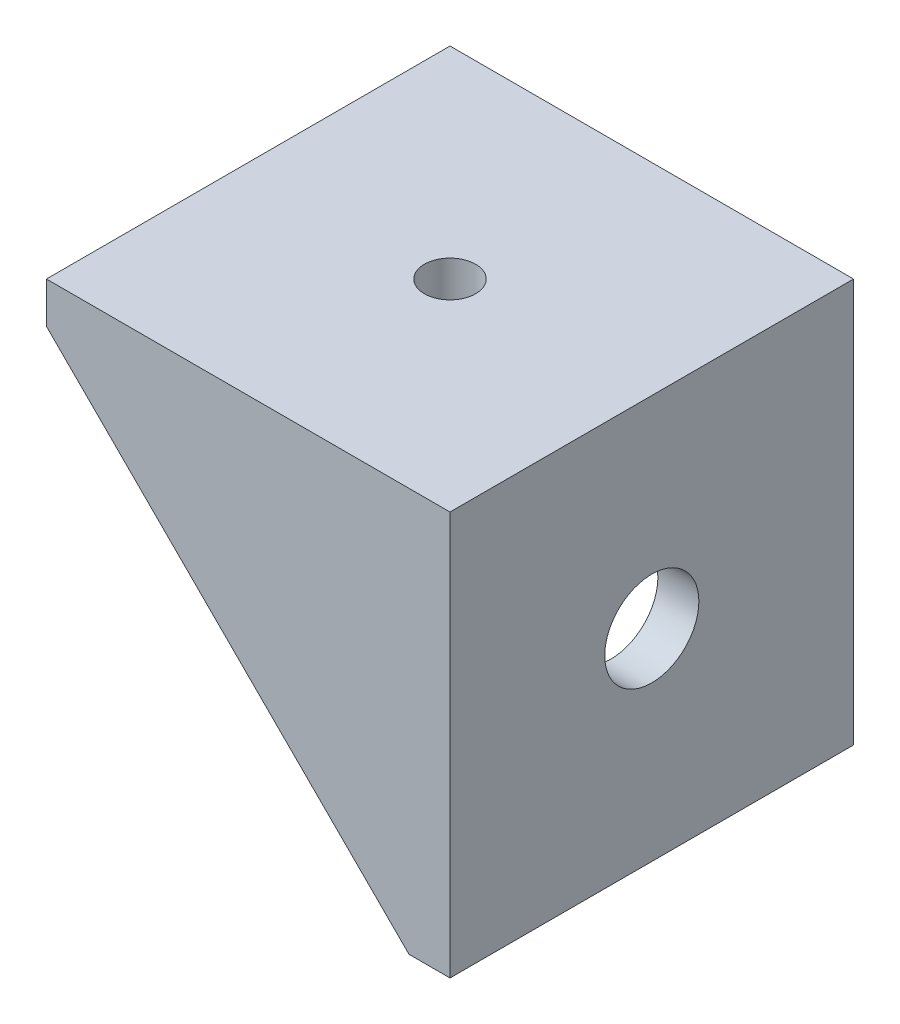
ISO-10303-21;
HEADER;
FILE_DESCRIPTION(('STEP AP214'),'2;1');
FILE_NAME('part.step','',(''),(''),'','','');
FILE_SCHEMA(('AUTOMOTIVE_DESIGN { 1 0 10303 214 1 1 1 1 }'));
ENDSEC;
DATA;
#1=APPLICATION_CONTEXT('core data for automotive mechanical design processes');
#2=APPLICATION_PROTOCOL_DEFINITION('international standard','automotive_design',2000,#1);
#3=PRODUCT_CONTEXT('',#1,'mechanical');
#4=PRODUCT('Part','Part','',(#3));
#5=PRODUCT_RELATED_PRODUCT_CATEGORY('part','',(#4));
#6=PRODUCT_DEFINITION_FORMATION('','',#4);
#7=PRODUCT_DEFINITION_CONTEXT('part definition',#1,'design');
#8=PRODUCT_DEFINITION('design','',#6,#7);
#9=PRODUCT_DEFINITION_SHAPE('','',#8);
#10=(LENGTH_UNIT() NAMED_UNIT(*) SI_UNIT(.MILLI.,.METRE.));
#11=(NAMED_UNIT(*) PLANE_ANGLE_UNIT() SI_UNIT($,.RADIAN.));
#12=(NAMED_UNIT(*) SI_UNIT($,.STERADIAN.) SOLID_ANGLE_UNIT());
#13=UNCERTAINTY_MEASURE_WITH_UNIT(LENGTH_MEASURE(1.E-05),#10,'distance_accuracy_value','');
#14=(GEOMETRIC_REPRESENTATION_CONTEXT(3) GLOBAL_UNCERTAINTY_ASSIGNED_CONTEXT((#13)) GLOBAL_UNIT_ASSIGNED_CONTEXT((#10,
#11,#12)) REPRESENTATION_CONTEXT('',''));
#15=CARTESIAN_POINT('',(0.,0.,0.));
#16=DIRECTION('',(0.,0.,1.));
#17=DIRECTION('',(1.,0.,0.));
#18=AXIS2_PLACEMENT_3D('',#15,#16,#17);
#19=CARTESIAN_POINT('',(0.,-3.048,15.));
#20=DIRECTION('',(0.,1.,0.));
#21=DIRECTION('',(0.,0.,1.));
#22=AXIS2_PLACEMENT_3D('',#19,#20,#21);
#23=PLANE('',#22);
#24=CARTESIAN_POINT('',(-15.,-3.048,0.));
#25=DIRECTION('',(0.,1.,0.));
#26=DIRECTION('',(0.,0.,1.));
#27=AXIS2_PLACEMENT_3D('',#24,#25,#26);
#28=CIRCLE('',#27,1.905);
#29=CARTESIAN_POINT('',(-15.,-3.048,1.905));
#30=VERTEX_POINT('',#29);
#31=EDGE_CURVE('E207',#30,#30,#28,.T.);
#32=ORIENTED_EDGE('',*,*,#31,.T.);
#33=EDGE_LOOP('',(#32));
#34=FACE_BOUND('',#33,.T.);
#35=DIRECTION('',(0.,0.,-1.));
#36=VECTOR('',#35,1.);
#37=CARTESIAN_POINT('',(-30.,-3.048,15.));
#38=LINE('',#37,#36);
#39=CARTESIAN_POINT('',(-30.,-3.048,11.952));
#40=VERTEX_POINT('',#39);
#41=CARTESIAN_POINT('',(-30.,-3.048,-11.952));
#42=VERTEX_POINT('',#41);
#43=EDGE_CURVE('E147',#40,#42,#38,.T.);
#44=ORIENTED_EDGE('',*,*,#43,.T.);
#45=DIRECTION('',(1.,0.,0.));
#46=VECTOR('',#45,1.);
#47=CARTESIAN_POINT('',(0.,-3.048,-11.952));
#48=LINE('',#47,#46);
#49=CARTESIAN_POINT('',(-3.048,-3.048,-11.952));
#50=VERTEX_POINT('',#49);
#51=EDGE_CURVE('E61',#42,#50,#48,.T.);
#52=ORIENTED_EDGE('',*,*,#51,.T.);
#53=DIRECTION('',(0.,0.,-1.));
#54=VECTOR('',#53,1.);
#55=CARTESIAN_POINT('',(-3.048,-3.048,15.));
#56=LINE('',#55,#54);
#57=CARTESIAN_POINT('',(-3.048,-3.048,11.952));
#58=VERTEX_POINT('',#57);
#59=EDGE_CURVE('E145',#58,#50,#56,.T.);
#60=ORIENTED_EDGE('',*,*,#59,.F.);
#61=DIRECTION('',(-1.,0.,0.));
#62=VECTOR('',#61,1.);
#63=CARTESIAN_POINT('',(0.,-3.048,11.952));
#64=LINE('',#63,#62);
#65=EDGE_CURVE('E119',#58,#40,#64,.T.);
#66=ORIENTED_EDGE('',*,*,#65,.T.);
#67=EDGE_LOOP('',(#44,#52,#60,#66));
#68=FACE_BOUND('',#67,.T.);
#69=ADVANCED_FACE('F45',(#34,#68),#23,.F.);
#70=CARTESIAN_POINT('',(-3.048,0.,15.));
#71=DIRECTION('',(1.,0.,0.));
#72=DIRECTION('',(0.,1.,0.));
#73=AXIS2_PLACEMENT_3D('',#70,#71,#72);
#74=PLANE('',#73);
#75=CARTESIAN_POINT('',(-3.048,-15.,0.));
#76=DIRECTION('',(1.,0.,0.));
#77=DIRECTION('',(0.,1.,0.));
#78=AXIS2_PLACEMENT_3D('',#75,#76,#77);
#79=CIRCLE('',#78,3.5);
#80=CARTESIAN_POINT('',(-3.048,-15.,-3.5));
#81=VERTEX_POINT('',#80);
#82=EDGE_CURVE('E223',#81,#81,#79,.T.);
#83=ORIENTED_EDGE('',*,*,#82,.T.);
#84=EDGE_LOOP('',(#83));
#85=FACE_BOUND('',#84,.T.);
#86=ORIENTED_EDGE('',*,*,#59,.T.);
#87=DIRECTION('',(0.,-1.,0.));
#88=VECTOR('',#87,1.);
#89=CARTESIAN_POINT('',(-3.048,0.,-11.952));
#90=LINE('',#89,#88);
#91=CARTESIAN_POINT('',(-3.048,-30.,-11.952));
#92=VERTEX_POINT('',#91);
#93=EDGE_CURVE('E68',#50,#92,#90,.T.);
#94=ORIENTED_EDGE('',*,*,#93,.T.);
#95=DIRECTION('',(0.,0.,-1.));
#96=VECTOR('',#95,1.);
#97=CARTESIAN_POINT('',(-3.048,-30.,15.));
#98=LINE('',#97,#96);
#99=CARTESIAN_POINT('',(-3.048,-30.,11.952));
#100=VERTEX_POINT('',#99);
#101=EDGE_CURVE('E133',#100,#92,#98,.T.);
#102=ORIENTED_EDGE('',*,*,#101,.F.);
#103=DIRECTION('',(0.,1.,0.));
#104=VECTOR('',#103,1.);
#105=CARTESIAN_POINT('',(-3.048,0.,11.952));
#106=LINE('',#105,#104);
#107=EDGE_CURVE('E114',#100,#58,#106,.T.);
#108=ORIENTED_EDGE('',*,*,#107,.T.);
#109=EDGE_LOOP('',(#86,#94,#102,#108));
#110=FACE_BOUND('',#109,.T.);
#111=ADVANCED_FACE('F134',(#85,#110),#74,.F.);
#112=CARTESIAN_POINT('',(0.,-30.,15.));
#113=DIRECTION('',(0.,1.,0.));
#114=DIRECTION('',(0.,0.,1.));
#115=AXIS2_PLACEMENT_3D('',#112,#113,#114);
#116=PLANE('',#115);
#117=DIRECTION('',(1.,0.,0.));
#118=VECTOR('',#117,1.);
#119=CARTESIAN_POINT('',(0.,-30.,-15.));
#120=LINE('',#119,#118);
#121=CARTESIAN_POINT('',(-3.048,-30.,-15.));
#122=VERTEX_POINT('',#121);
#123=CARTESIAN_POINT('',(0.,-30.,-15.));
#124=VERTEX_POINT('',#123);
#125=EDGE_CURVE('E178',#122,#124,#120,.T.);
#126=ORIENTED_EDGE('',*,*,#125,.T.);
#127=DIRECTION('',(0.,0.,-1.));
#128=VECTOR('',#127,1.);
#129=CARTESIAN_POINT('',(0.,-30.,15.));
#130=LINE('',#129,#128);
#131=CARTESIAN_POINT('',(0.,-30.,15.));
#132=VERTEX_POINT('',#131);
#133=EDGE_CURVE('E11',#132,#124,#130,.T.);
#134=ORIENTED_EDGE('',*,*,#133,.F.);
#135=DIRECTION('',(1.,0.,0.));
#136=VECTOR('',#135,1.);
#137=CARTESIAN_POINT('',(0.,-30.,15.));
#138=LINE('',#137,#136);
#139=CARTESIAN_POINT('',(-3.048,-30.,15.));
#140=VERTEX_POINT('',#139);
#141=EDGE_CURVE('E143',#140,#132,#138,.T.);
#142=ORIENTED_EDGE('',*,*,#141,.F.);
#143=EDGE_CURVE('E126',#140,#100,#98,.T.);
#144=ORIENTED_EDGE('',*,*,#143,.T.);
#145=ORIENTED_EDGE('',*,*,#101,.T.);
#146=DIRECTION('',(0.,0.,-1.));
#147=VECTOR('',#146,1.);
#148=CARTESIAN_POINT('',(-3.048,-30.,-11.952));
#149=LINE('',#148,#147);
#150=EDGE_CURVE('E198',#92,#122,#149,.T.);
#151=ORIENTED_EDGE('',*,*,#150,.T.);
#152=EDGE_LOOP('',(#126,#134,#142,#144,#145,#151));
#153=FACE_BOUND('',#152,.T.);
#154=ADVANCED_FACE('F47',(#153),#116,.F.);
#155=CARTESIAN_POINT('',(0.,0.,15.));
#156=DIRECTION('',(-1.,0.,0.));
#157=DIRECTION('',(0.,0.,1.));
#158=AXIS2_PLACEMENT_3D('',#155,#156,#157);
#159=PLANE('',#158);
#160=CARTESIAN_POINT('',(0.,-15.,0.));
#161=DIRECTION('',(1.,0.,0.));
#162=DIRECTION('',(0.,0.,-1.));
#163=AXIS2_PLACEMENT_3D('',#160,#161,#162);
#164=CIRCLE('',#163,3.5);
#165=CARTESIAN_POINT('',(0.,-15.,-3.5));
#166=VERTEX_POINT('',#165);
#167=EDGE_CURVE('E227',#166,#166,#164,.T.);
#168=ORIENTED_EDGE('',*,*,#167,.F.);
#169=EDGE_LOOP('',(#168));
#170=FACE_BOUND('',#169,.T.);
#171=DIRECTION('',(0.,1.,0.));
#172=VECTOR('',#171,1.);
#173=CARTESIAN_POINT('',(0.,0.,-15.));
#174=LINE('',#173,#172);
#175=CARTESIAN_POINT('',(0.,0.,-15.));
#176=VERTEX_POINT('',#175);
#177=EDGE_CURVE('E173',#124,#176,#174,.T.);
#178=ORIENTED_EDGE('',*,*,#177,.T.);
#179=DIRECTION('',(0.,0.,-1.));
#180=VECTOR('',#179,1.);
#181=CARTESIAN_POINT('',(0.,0.,15.));
#182=LINE('',#181,#180);
#183=CARTESIAN_POINT('',(0.,0.,15.));
#184=VERTEX_POINT('',#183);
#185=EDGE_CURVE('E54',#184,#176,#182,.T.);
#186=ORIENTED_EDGE('',*,*,#185,.F.);
#187=DIRECTION('',(0.,1.,0.));
#188=VECTOR('',#187,1.);
#189=CARTESIAN_POINT('',(0.,0.,15.));
#190=LINE('',#189,#188);
#191=EDGE_CURVE('E188',#132,#184,#190,.T.);
#192=ORIENTED_EDGE('',*,*,#191,.F.);
#193=ORIENTED_EDGE('',*,*,#133,.T.);
#194=EDGE_LOOP('',(#178,#186,#192,#193));
#195=FACE_BOUND('',#194,.T.);
#196=ADVANCED_FACE('F235',(#170,#195),#159,.F.);
#197=CARTESIAN_POINT('',(0.,0.,15.));
#198=DIRECTION('',(0.,-1.,0.));
#199=DIRECTION('',(0.,0.,-1.));
#200=AXIS2_PLACEMENT_3D('',#197,#198,#199);
#201=PLANE('',#200);
#202=CARTESIAN_POINT('',(-15.,0.,0.));
#203=DIRECTION('',(0.,1.,0.));
#204=DIRECTION('',(0.,0.,1.));
#205=AXIS2_PLACEMENT_3D('',#202,#203,#204);
#206=CIRCLE('',#205,1.905);
#207=CARTESIAN_POINT('',(-15.,0.,1.905));
#208=VERTEX_POINT('',#207);
#209=EDGE_CURVE('E219',#208,#208,#206,.T.);
#210=ORIENTED_EDGE('',*,*,#209,.F.);
#211=EDGE_LOOP('',(#210));
#212=FACE_BOUND('',#211,.T.);
#213=DIRECTION('',(-1.,0.,0.));
#214=VECTOR('',#213,1.);
#215=CARTESIAN_POINT('',(0.,0.,-15.));
#216=LINE('',#215,#214);
#217=CARTESIAN_POINT('',(-30.,0.,-15.));
#218=VERTEX_POINT('',#217);
#219=EDGE_CURVE('E166',#176,#218,#216,.T.);
#220=ORIENTED_EDGE('',*,*,#219,.T.);
#221=DIRECTION('',(0.,0.,-1.));
#222=VECTOR('',#221,1.);
#223=CARTESIAN_POINT('',(-30.,0.,15.));
#224=LINE('',#223,#222);
#225=CARTESIAN_POINT('',(-30.,0.,15.));
#226=VERTEX_POINT('',#225);
#227=EDGE_CURVE('E155',#226,#218,#224,.T.);
#228=ORIENTED_EDGE('',*,*,#227,.F.);
#229=DIRECTION('',(-1.,0.,0.));
#230=VECTOR('',#229,1.);
#231=CARTESIAN_POINT('',(0.,0.,15.));
#232=LINE('',#231,#230);
#233=EDGE_CURVE('E167',#184,#226,#232,.T.);
#234=ORIENTED_EDGE('',*,*,#233,.F.);
#235=ORIENTED_EDGE('',*,*,#185,.T.);
#236=EDGE_LOOP('',(#220,#228,#234,#235));
#237=FACE_BOUND('',#236,.T.);
#238=ADVANCED_FACE('F164',(#212,#237),#201,.F.);
#239=CARTESIAN_POINT('',(-30.,0.,15.));
#240=DIRECTION('',(1.,0.,0.));
#241=DIRECTION('',(0.,0.,-1.));
#242=AXIS2_PLACEMENT_3D('',#239,#240,#241);
#243=PLANE('',#242);
#244=DIRECTION('',(0.,-1.,0.));
#245=VECTOR('',#244,1.);
#246=CARTESIAN_POINT('',(-30.,0.,-15.));
#247=LINE('',#246,#245);
#248=CARTESIAN_POINT('',(-30.,-3.048,-15.));
#249=VERTEX_POINT('',#248);
#250=EDGE_CURVE('E150',#218,#249,#247,.T.);
#251=ORIENTED_EDGE('',*,*,#250,.T.);
#252=DIRECTION('',(0.,0.,-1.));
#253=VECTOR('',#252,1.);
#254=CARTESIAN_POINT('',(-30.,-3.048,-11.952));
#255=LINE('',#254,#253);
#256=EDGE_CURVE('E195',#42,#249,#255,.T.);
#257=ORIENTED_EDGE('',*,*,#256,.F.);
#258=ORIENTED_EDGE('',*,*,#43,.F.);
#259=CARTESIAN_POINT('',(-30.,-3.048,15.));
#260=VERTEX_POINT('',#259);
#261=EDGE_CURVE('E129',#260,#40,#38,.T.);
#262=ORIENTED_EDGE('',*,*,#261,.F.);
#263=DIRECTION('',(0.,-1.,0.));
#264=VECTOR('',#263,1.);
#265=CARTESIAN_POINT('',(-30.,0.,15.));
#266=LINE('',#265,#264);
#267=EDGE_CURVE('E138',#226,#260,#266,.T.);
#268=ORIENTED_EDGE('',*,*,#267,.F.);
#269=ORIENTED_EDGE('',*,*,#227,.T.);
#270=EDGE_LOOP('',(#251,#257,#258,#262,#268,#269));
#271=FACE_BOUND('',#270,.T.);
#272=ADVANCED_FACE('F243',(#271),#243,.F.);
#273=CARTESIAN_POINT('',(0.,0.,15.));
#274=DIRECTION('',(0.,0.,1.));
#275=DIRECTION('',(1.,0.,0.));
#276=AXIS2_PLACEMENT_3D('',#273,#274,#275);
#277=PLANE('',#276);
#278=ORIENTED_EDGE('',*,*,#141,.T.);
#279=ORIENTED_EDGE('',*,*,#191,.T.);
#280=ORIENTED_EDGE('',*,*,#233,.T.);
#281=ORIENTED_EDGE('',*,*,#267,.T.);
#282=DIRECTION('',(0.707106781186548,-0.707106781186548,0.));
#283=VECTOR('',#282,1.);
#284=CARTESIAN_POINT('',(-16.524,-16.524,15.));
#285=LINE('',#284,#283);
#286=EDGE_CURVE('E131',#260,#140,#285,.T.);
#287=ORIENTED_EDGE('',*,*,#286,.T.);
#288=EDGE_LOOP('',(#278,#279,#280,#281,#287));
#289=FACE_BOUND('',#288,.T.);
#290=ADVANCED_FACE('F269',(#289),#277,.T.);
#291=CARTESIAN_POINT('',(0.,0.,-15.));
#292=DIRECTION('',(0.,0.,1.));
#293=DIRECTION('',(1.,0.,0.));
#294=AXIS2_PLACEMENT_3D('',#291,#292,#293);
#295=PLANE('',#294);
#296=ORIENTED_EDGE('',*,*,#125,.F.);
#297=DIRECTION('',(-0.707106781186548,0.707106781186548,0.));
#298=VECTOR('',#297,1.);
#299=CARTESIAN_POINT('',(-16.524,-16.524,-15.));
#300=LINE('',#299,#298);
#301=EDGE_CURVE('E204',#122,#249,#300,.T.);
#302=ORIENTED_EDGE('',*,*,#301,.T.);
#303=ORIENTED_EDGE('',*,*,#250,.F.);
#304=ORIENTED_EDGE('',*,*,#219,.F.);
#305=ORIENTED_EDGE('',*,*,#177,.F.);
#306=EDGE_LOOP('',(#296,#302,#303,#304,#305));
#307=FACE_BOUND('',#306,.T.);
#308=ADVANCED_FACE('F172',(#307),#295,.F.);
#309=CARTESIAN_POINT('',(-16.524,-16.524,11.952));
#310=DIRECTION('',(-0.707106781186547,-0.707106781186547,0.));
#311=DIRECTION('',(0.707106781186548,-0.707106781186548,0.));
#312=AXIS2_PLACEMENT_3D('',#309,#310,#311);
#313=PLANE('',#312);
#314=ORIENTED_EDGE('',*,*,#286,.F.);
#315=ORIENTED_EDGE('',*,*,#261,.T.);
#316=DIRECTION('',(0.707106781186548,-0.707106781186548,0.));
#317=VECTOR('',#316,1.);
#318=CARTESIAN_POINT('',(-16.524,-16.524,11.952));
#319=LINE('',#318,#317);
#320=EDGE_CURVE('E117',#40,#100,#319,.T.);
#321=ORIENTED_EDGE('',*,*,#320,.T.);
#322=ORIENTED_EDGE('',*,*,#143,.F.);
#323=EDGE_LOOP('',(#314,#315,#321,#322));
#324=FACE_BOUND('',#323,.T.);
#325=ADVANCED_FACE('F124',(#324),#313,.T.);
#326=CARTESIAN_POINT('',(0.,0.,11.952));
#327=DIRECTION('',(0.,0.,1.));
#328=DIRECTION('',(1.,0.,0.));
#329=AXIS2_PLACEMENT_3D('',#326,#327,#328);
#330=PLANE('',#329);
#331=ORIENTED_EDGE('',*,*,#320,.F.);
#332=ORIENTED_EDGE('',*,*,#65,.F.);
#333=ORIENTED_EDGE('',*,*,#107,.F.);
#334=EDGE_LOOP('',(#331,#332,#333));
#335=FACE_BOUND('',#334,.T.);
#336=ADVANCED_FACE('F116',(#335),#330,.F.);
#337=CARTESIAN_POINT('',(-16.524,-16.524,-11.952));
#338=DIRECTION('',(-0.707106781186547,-0.707106781186547,0.));
#339=DIRECTION('',(0.707106781186548,-0.707106781186548,0.));
#340=AXIS2_PLACEMENT_3D('',#337,#338,#339);
#341=PLANE('',#340);
#342=ORIENTED_EDGE('',*,*,#301,.F.);
#343=ORIENTED_EDGE('',*,*,#150,.F.);
#344=DIRECTION('',(-0.707106781186548,0.707106781186548,0.));
#345=VECTOR('',#344,1.);
#346=CARTESIAN_POINT('',(-16.524,-16.524,-11.952));
#347=LINE('',#346,#345);
#348=EDGE_CURVE('E210',#92,#42,#347,.T.);
#349=ORIENTED_EDGE('',*,*,#348,.T.);
#350=ORIENTED_EDGE('',*,*,#256,.T.);
#351=EDGE_LOOP('',(#342,#343,#349,#350));
#352=FACE_BOUND('',#351,.T.);
#353=ADVANCED_FACE('F239',(#352),#341,.T.);
#354=CARTESIAN_POINT('',(0.,0.,-11.952));
#355=DIRECTION('',(0.,0.,1.));
#356=DIRECTION('',(1.,0.,0.));
#357=AXIS2_PLACEMENT_3D('',#354,#355,#356);
#358=PLANE('',#357);
#359=ORIENTED_EDGE('',*,*,#93,.F.);
#360=ORIENTED_EDGE('',*,*,#51,.F.);
#361=ORIENTED_EDGE('',*,*,#348,.F.);
#362=EDGE_LOOP('',(#359,#360,#361));
#363=FACE_BOUND('',#362,.T.);
#364=ADVANCED_FACE('F246',(#363),#358,.T.);
#365=CARTESIAN_POINT('',(-15.,-30.,0.));
#366=DIRECTION('',(0.,1.,0.));
#367=DIRECTION('',(0.,0.,1.));
#368=AXIS2_PLACEMENT_3D('',#365,#366,#367);
#369=CYLINDRICAL_SURFACE('',#368,1.905);
#370=CARTESIAN_POINT('',(-15.,0.,1.905));
#371=CARTESIAN_POINT('',(-15.,-0.0317500000000005,1.905));
#372=CARTESIAN_POINT('',(-15.,-0.0635000000000011,1.905));
#373=CARTESIAN_POINT('',(-15.,-0.127000000000001,1.905));
#374=CARTESIAN_POINT('',(-15.,-0.15875,1.905));
#375=CARTESIAN_POINT('',(-15.,-0.22225,1.905));
#376=CARTESIAN_POINT('',(-15.,-0.254000000000001,1.905));
#377=CARTESIAN_POINT('',(-15.,-0.317500000000001,1.905));
#378=CARTESIAN_POINT('',(-15.,-0.34925,1.905));
#379=CARTESIAN_POINT('',(-15.,-0.41275,1.905));
#380=CARTESIAN_POINT('',(-15.,-0.4445,1.905));
#381=CARTESIAN_POINT('',(-15.,-0.508,1.905));
#382=CARTESIAN_POINT('',(-15.,-0.53975,1.905));
#383=CARTESIAN_POINT('',(-15.,-0.60325,1.905));
#384=CARTESIAN_POINT('',(-15.,-0.635,1.905));
#385=CARTESIAN_POINT('',(-15.,-0.6985,1.905));
#386=CARTESIAN_POINT('',(-15.,-0.730249999999999,1.905));
#387=CARTESIAN_POINT('',(-15.,-0.793749999999999,1.905));
#388=CARTESIAN_POINT('',(-15.,-0.8255,1.905));
#389=CARTESIAN_POINT('',(-15.,-0.889000000000001,1.905));
#390=CARTESIAN_POINT('',(-15.,-0.920750000000001,1.905));
#391=CARTESIAN_POINT('',(-15.,-0.984250000000001,1.905));
#392=CARTESIAN_POINT('',(-15.,-1.016,1.905));
#393=CARTESIAN_POINT('',(-15.,-1.0795,1.905));
#394=CARTESIAN_POINT('',(-15.,-1.11125,1.905));
#395=CARTESIAN_POINT('',(-15.,-1.17475,1.905));
#396=CARTESIAN_POINT('',(-15.,-1.2065,1.905));
#397=CARTESIAN_POINT('',(-15.,-1.27,1.905));
#398=CARTESIAN_POINT('',(-15.,-1.30175,1.905));
#399=CARTESIAN_POINT('',(-15.,-1.36525,1.905));
#400=CARTESIAN_POINT('',(-15.,-1.397,1.905));
#401=CARTESIAN_POINT('',(-15.,-1.4605,1.905));
#402=CARTESIAN_POINT('',(-15.,-1.49225,1.905));
#403=CARTESIAN_POINT('',(-15.,-1.55575,1.905));
#404=CARTESIAN_POINT('',(-15.,-1.5875,1.905));
#405=CARTESIAN_POINT('',(-15.,-1.651,1.905));
#406=CARTESIAN_POINT('',(-15.,-1.68275,1.905));
#407=CARTESIAN_POINT('',(-15.,-1.74625,1.905));
#408=CARTESIAN_POINT('',(-15.,-1.778,1.905));
#409=CARTESIAN_POINT('',(-15.,-1.8415,1.905));
#410=CARTESIAN_POINT('',(-15.,-1.87325,1.905));
#411=CARTESIAN_POINT('',(-15.,-1.93675,1.905));
#412=CARTESIAN_POINT('',(-15.,-1.9685,1.905));
#413=CARTESIAN_POINT('',(-15.,-2.032,1.905));
#414=CARTESIAN_POINT('',(-15.,-2.06375,1.905));
#415=CARTESIAN_POINT('',(-15.,-2.12725,1.905));
#416=CARTESIAN_POINT('',(-15.,-2.159,1.905));
#417=CARTESIAN_POINT('',(-15.,-2.2225,1.905));
#418=CARTESIAN_POINT('',(-15.,-2.25425,1.905));
#419=CARTESIAN_POINT('',(-15.,-2.31775,1.905));
#420=CARTESIAN_POINT('',(-15.,-2.3495,1.905));
#421=CARTESIAN_POINT('',(-15.,-2.413,1.905));
#422=CARTESIAN_POINT('',(-15.,-2.44475,1.905));
#423=CARTESIAN_POINT('',(-15.,-2.50825,1.905));
#424=CARTESIAN_POINT('',(-15.,-2.54,1.905));
#425=CARTESIAN_POINT('',(-15.,-2.6035,1.905));
#426=CARTESIAN_POINT('',(-15.,-2.63525,1.905));
#427=CARTESIAN_POINT('',(-15.,-2.69875,1.905));
#428=CARTESIAN_POINT('',(-15.,-2.7305,1.905));
#429=CARTESIAN_POINT('',(-15.,-2.794,1.905));
#430=CARTESIAN_POINT('',(-15.,-2.82575,1.905));
#431=CARTESIAN_POINT('',(-15.,-2.88925,1.905));
#432=CARTESIAN_POINT('',(-15.,-2.921,1.905));
#433=CARTESIAN_POINT('',(-15.,-2.9845,1.905));
#434=CARTESIAN_POINT('',(-15.,-3.01625,1.905));
#435=CARTESIAN_POINT('',(-15.,-3.048,1.905));
#436=B_SPLINE_CURVE_WITH_KNOTS('',3,(#370,#371,#372,#373,#374,#375,#376,#377,#378,#379,#380,
#381,#382,#383,#384,#385,#386,#387,#388,#389,#390,#391,#392,#393,#394,#395,#396,#397,#398,#399,
#400,#401,#402,#403,#404,#405,#406,#407,#408,#409,#410,#411,#412,#413,#414,#415,#416,#417,#418,
#419,#420,#421,#422,#423,#424,#425,#426,#427,#428,#429,#430,#431,#432,#433,#434,#435),
.UNSPECIFIED.,.F.,.F.,(4,2,2,2,2,2,2,2,2,2,2,2,2,2,2,2,2,2,2,2,2,2,2,2,2,2,2,2,2,2,2,2,4),(0.,
0.0952500000000016,0.1905,0.285750000000001,0.380999999999999,0.476250000000001,
0.571499999999999,0.666750000000001,0.761999999999999,0.85725,0.952500000000002,1.04775,1.143,
1.23825,1.3335,1.42875,1.524,1.61925,1.7145,1.80975,1.905,2.00025,2.0955,2.19075,2.286,2.38125,
2.4765,2.57175,2.667,2.76225,2.8575,2.95275,3.048),.UNSPECIFIED.);
#437=EDGE_CURVE('BSEAM248',#208,#30,#436,.T.);
#438=ORIENTED_EDGE('',*,*,#209,.T.);
#439=ORIENTED_EDGE('',*,*,#31,.F.);
#440=ORIENTED_EDGE('',*,*,#437,.T.);
#441=ORIENTED_EDGE('',*,*,#437,.F.);
#442=EDGE_LOOP('',(#438,#440,#439,#441));
#443=FACE_BOUND('',#442,.T.);
#444=ADVANCED_FACE('F248',(#443),#369,.F.);
#445=CARTESIAN_POINT('',(-30.,-15.,0.));
#446=DIRECTION('',(1.,0.,0.));
#447=DIRECTION('',(0.,0.,-1.));
#448=AXIS2_PLACEMENT_3D('',#445,#446,#447);
#449=CYLINDRICAL_SURFACE('',#448,3.5);
#450=CARTESIAN_POINT('',(0.,-15.,-3.5));
#451=CARTESIAN_POINT('',(-0.0317500000000005,-15.,-3.5));
#452=CARTESIAN_POINT('',(-0.0635000000000011,-15.,-3.5));
#453=CARTESIAN_POINT('',(-0.127000000000001,-15.,-3.5));
#454=CARTESIAN_POINT('',(-0.15875,-15.,-3.5));
#455=CARTESIAN_POINT('',(-0.22225,-15.,-3.5));
#456=CARTESIAN_POINT('',(-0.254000000000001,-15.,-3.5));
#457=CARTESIAN_POINT('',(-0.317500000000001,-15.,-3.5));
#458=CARTESIAN_POINT('',(-0.34925,-15.,-3.5));
#459=CARTESIAN_POINT('',(-0.41275,-15.,-3.5));
#460=CARTESIAN_POINT('',(-0.4445,-15.,-3.5));
#461=CARTESIAN_POINT('',(-0.508,-15.,-3.5));
#462=CARTESIAN_POINT('',(-0.53975,-15.,-3.5));
#463=CARTESIAN_POINT('',(-0.60325,-15.,-3.5));
#464=CARTESIAN_POINT('',(-0.635,-15.,-3.5));
#465=CARTESIAN_POINT('',(-0.6985,-15.,-3.5));
#466=CARTESIAN_POINT('',(-0.730249999999999,-15.,-3.5));
#467=CARTESIAN_POINT('',(-0.793749999999999,-15.,-3.5));
#468=CARTESIAN_POINT('',(-0.8255,-15.,-3.5));
#469=CARTESIAN_POINT('',(-0.889000000000001,-15.,-3.5));
#470=CARTESIAN_POINT('',(-0.920750000000001,-15.,-3.5));
#471=CARTESIAN_POINT('',(-0.984250000000001,-15.,-3.5));
#472=CARTESIAN_POINT('',(-1.016,-15.,-3.5));
#473=CARTESIAN_POINT('',(-1.0795,-15.,-3.5));
#474=CARTESIAN_POINT('',(-1.11125,-15.,-3.5));
#475=CARTESIAN_POINT('',(-1.17475,-15.,-3.5));
#476=CARTESIAN_POINT('',(-1.2065,-15.,-3.5));
#477=CARTESIAN_POINT('',(-1.27,-15.,-3.5));
#478=CARTESIAN_POINT('',(-1.30175,-15.,-3.5));
#479=CARTESIAN_POINT('',(-1.36525,-15.,-3.5));
#480=CARTESIAN_POINT('',(-1.397,-15.,-3.5));
#481=CARTESIAN_POINT('',(-1.4605,-15.,-3.5));
#482=CARTESIAN_POINT('',(-1.49225,-15.,-3.5));
#483=CARTESIAN_POINT('',(-1.55575,-15.,-3.5));
#484=CARTESIAN_POINT('',(-1.5875,-15.,-3.5));
#485=CARTESIAN_POINT('',(-1.651,-15.,-3.5));
#486=CARTESIAN_POINT('',(-1.68275,-15.,-3.5));
#487=CARTESIAN_POINT('',(-1.74625,-15.,-3.5));
#488=CARTESIAN_POINT('',(-1.778,-15.,-3.5));
#489=CARTESIAN_POINT('',(-1.8415,-15.,-3.5));
#490=CARTESIAN_POINT('',(-1.87325,-15.,-3.5));
#491=CARTESIAN_POINT('',(-1.93675,-15.,-3.5));
#492=CARTESIAN_POINT('',(-1.9685,-15.,-3.5));
#493=CARTESIAN_POINT('',(-2.032,-15.,-3.5));
#494=CARTESIAN_POINT('',(-2.06375,-15.,-3.5));
#495=CARTESIAN_POINT('',(-2.12725,-15.,-3.5));
#496=CARTESIAN_POINT('',(-2.159,-15.,-3.5));
#497=CARTESIAN_POINT('',(-2.2225,-15.,-3.5));
#498=CARTESIAN_POINT('',(-2.25425,-15.,-3.5));
#499=CARTESIAN_POINT('',(-2.31775,-15.,-3.5));
#500=CARTESIAN_POINT('',(-2.3495,-15.,-3.5));
#501=CARTESIAN_POINT('',(-2.413,-15.,-3.5));
#502=CARTESIAN_POINT('',(-2.44475,-15.,-3.5));
#503=CARTESIAN_POINT('',(-2.50825,-15.,-3.5));
#504=CARTESIAN_POINT('',(-2.54,-15.,-3.5));
#505=CARTESIAN_POINT('',(-2.6035,-15.,-3.5));
#506=CARTESIAN_POINT('',(-2.63525,-15.,-3.5));
#507=CARTESIAN_POINT('',(-2.69875,-15.,-3.5));
#508=CARTESIAN_POINT('',(-2.7305,-15.,-3.5));
#509=CARTESIAN_POINT('',(-2.794,-15.,-3.5));
#510=CARTESIAN_POINT('',(-2.82575,-15.,-3.5));
#511=CARTESIAN_POINT('',(-2.88925,-15.,-3.5));
#512=CARTESIAN_POINT('',(-2.921,-15.,-3.5));
#513=CARTESIAN_POINT('',(-2.9845,-15.,-3.5));
#514=CARTESIAN_POINT('',(-3.01625,-15.,-3.5));
#515=CARTESIAN_POINT('',(-3.048,-15.,-3.5));
#516=B_SPLINE_CURVE_WITH_KNOTS('',3,(#450,#451,#452,#453,#454,#455,#456,#457,#458,#459,#460,
#461,#462,#463,#464,#465,#466,#467,#468,#469,#470,#471,#472,#473,#474,#475,#476,#477,#478,#479,
#480,#481,#482,#483,#484,#485,#486,#487,#488,#489,#490,#491,#492,#493,#494,#495,#496,#497,#498,
#499,#500,#501,#502,#503,#504,#505,#506,#507,#508,#509,#510,#511,#512,#513,#514,#515),
.UNSPECIFIED.,.F.,.F.,(4,2,2,2,2,2,2,2,2,2,2,2,2,2,2,2,2,2,2,2,2,2,2,2,2,2,2,2,2,2,2,2,4),(0.,
0.0952500000000016,0.1905,0.285750000000001,0.380999999999999,0.476250000000001,
0.571499999999999,0.666750000000001,0.761999999999999,0.85725,0.952500000000002,1.04775,1.143,
1.23825,1.3335,1.42875,1.524,1.61925,1.7145,1.80975,1.905,2.00025,2.0955,2.19075,2.286,2.38125,
2.4765,2.57175,2.667,2.76225,2.8575,2.95275,3.048),.UNSPECIFIED.);
#517=EDGE_CURVE('BSEAM232',#166,#81,#516,.T.);
#518=ORIENTED_EDGE('',*,*,#167,.T.);
#519=ORIENTED_EDGE('',*,*,#82,.F.);
#520=ORIENTED_EDGE('',*,*,#517,.T.);
#521=ORIENTED_EDGE('',*,*,#517,.F.);
#522=EDGE_LOOP('',(#518,#520,#519,#521));
#523=FACE_BOUND('',#522,.T.);
#524=ADVANCED_FACE('F232',(#523),#449,.F.);
#525=CLOSED_SHELL('',(#69,#111,#154,#196,#238,#272,#290,#308,#325,#336,#353,#364,#444,#524));
#526=MANIFOLD_SOLID_BREP('B2',#525);
#527=ADVANCED_BREP_SHAPE_REPRESENTATION('',(#18,#526),#14);
#528=SHAPE_DEFINITION_REPRESENTATION(#9,#527);
ENDSEC;
END-ISO-10303-21;
